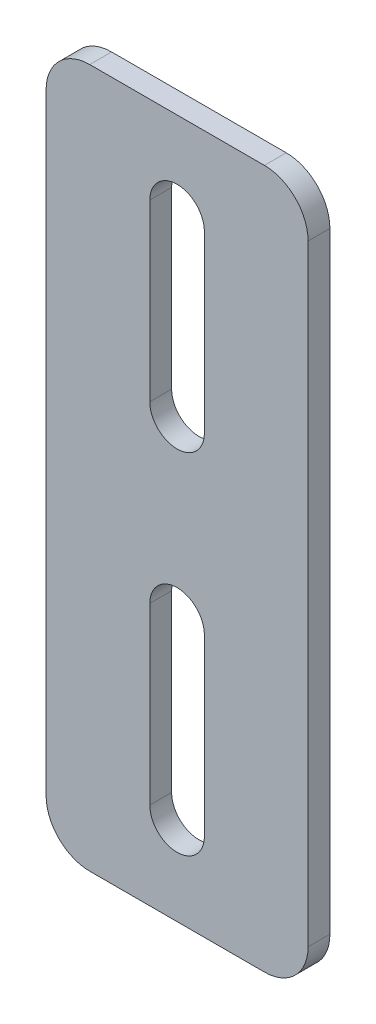
ISO-10303-21;
HEADER;
FILE_DESCRIPTION(('STEP AP214'),'2;1');
FILE_NAME('part.step','',(''),(''),'','','');
FILE_SCHEMA(('AUTOMOTIVE_DESIGN { 1 0 10303 214 1 1 1 1 }'));
ENDSEC;
DATA;
#1=APPLICATION_CONTEXT('core data for automotive mechanical design processes');
#2=APPLICATION_PROTOCOL_DEFINITION('international standard','automotive_design',2000,#1);
#3=PRODUCT_CONTEXT('',#1,'mechanical');
#4=PRODUCT('Part','Part','',(#3));
#5=PRODUCT_RELATED_PRODUCT_CATEGORY('part','',(#4));
#6=PRODUCT_DEFINITION_FORMATION('','',#4);
#7=PRODUCT_DEFINITION_CONTEXT('part definition',#1,'design');
#8=PRODUCT_DEFINITION('design','',#6,#7);
#9=PRODUCT_DEFINITION_SHAPE('','',#8);
#10=(LENGTH_UNIT() NAMED_UNIT(*) SI_UNIT(.MILLI.,.METRE.));
#11=(NAMED_UNIT(*) PLANE_ANGLE_UNIT() SI_UNIT($,.RADIAN.));
#12=(NAMED_UNIT(*) SI_UNIT($,.STERADIAN.) SOLID_ANGLE_UNIT());
#13=UNCERTAINTY_MEASURE_WITH_UNIT(LENGTH_MEASURE(1.E-05),#10,'distance_accuracy_value','');
#14=(GEOMETRIC_REPRESENTATION_CONTEXT(3) GLOBAL_UNCERTAINTY_ASSIGNED_CONTEXT((#13)) GLOBAL_UNIT_ASSIGNED_CONTEXT((#10,
#11,#12)) REPRESENTATION_CONTEXT('',''));
#15=CARTESIAN_POINT('',(0.,0.,0.));
#16=DIRECTION('',(0.,0.,1.));
#17=DIRECTION('',(1.,0.,0.));
#18=AXIS2_PLACEMENT_3D('',#15,#16,#17);
#19=CARTESIAN_POINT('',(19.05,-50.8,3.175));
#20=DIRECTION('',(-1.,0.,0.));
#21=DIRECTION('',(0.,0.,1.));
#22=AXIS2_PLACEMENT_3D('',#19,#20,#21);
#23=PLANE('',#22);
#24=DIRECTION('',(0.,1.,0.));
#25=VECTOR('',#24,1.);
#26=CARTESIAN_POINT('',(19.05,-50.8,3.175));
#27=LINE('',#26,#25);
#28=CARTESIAN_POINT('',(19.05,-44.45,3.175));
#29=VERTEX_POINT('',#28);
#30=CARTESIAN_POINT('',(19.05,44.45,3.175));
#31=VERTEX_POINT('',#30);
#32=EDGE_CURVE('E215',#29,#31,#27,.T.);
#33=ORIENTED_EDGE('',*,*,#32,.F.);
#34=DIRECTION('',(0.,0.,-1.));
#35=VECTOR('',#34,1.);
#36=CARTESIAN_POINT('',(19.05,-44.45,3.175));
#37=LINE('',#36,#35);
#38=CARTESIAN_POINT('',(19.05,-44.45,0.));
#39=VERTEX_POINT('',#38);
#40=EDGE_CURVE('E266',#29,#39,#37,.T.);
#41=ORIENTED_EDGE('',*,*,#40,.T.);
#42=DIRECTION('',(0.,1.,0.));
#43=VECTOR('',#42,1.);
#44=CARTESIAN_POINT('',(19.05,-50.8,0.));
#45=LINE('',#44,#43);
#46=CARTESIAN_POINT('',(19.05,44.45,0.));
#47=VERTEX_POINT('',#46);
#48=EDGE_CURVE('E208',#39,#47,#45,.T.);
#49=ORIENTED_EDGE('',*,*,#48,.T.);
#50=DIRECTION('',(0.,0.,-1.));
#51=VECTOR('',#50,1.);
#52=CARTESIAN_POINT('',(19.05,44.45,3.175));
#53=LINE('',#52,#51);
#54=EDGE_CURVE('E264',#47,#31,#53,.F.);
#55=ORIENTED_EDGE('',*,*,#54,.T.);
#56=EDGE_LOOP('',(#33,#41,#49,#55));
#57=FACE_BOUND('',#56,.T.);
#58=ADVANCED_FACE('F34',(#57),#23,.F.);
#59=CARTESIAN_POINT('',(-19.05,50.8,3.175));
#60=DIRECTION('',(0.,-1.,0.));
#61=DIRECTION('',(0.,0.,-1.));
#62=AXIS2_PLACEMENT_3D('',#59,#60,#61);
#63=PLANE('',#62);
#64=DIRECTION('',(-1.,0.,0.));
#65=VECTOR('',#64,1.);
#66=CARTESIAN_POINT('',(-19.05,50.8,0.));
#67=LINE('',#66,#65);
#68=CARTESIAN_POINT('',(12.7,50.8,0.));
#69=VERTEX_POINT('',#68);
#70=CARTESIAN_POINT('',(-12.7,50.8,0.));
#71=VERTEX_POINT('',#70);
#72=EDGE_CURVE('E231',#69,#71,#67,.T.);
#73=ORIENTED_EDGE('',*,*,#72,.T.);
#74=DIRECTION('',(0.,0.,-1.));
#75=VECTOR('',#74,1.);
#76=CARTESIAN_POINT('',(-12.7,50.8,3.175));
#77=LINE('',#76,#75);
#78=CARTESIAN_POINT('',(-12.7,50.8,3.175));
#79=VERTEX_POINT('',#78);
#80=EDGE_CURVE('E11',#71,#79,#77,.F.);
#81=ORIENTED_EDGE('',*,*,#80,.T.);
#82=DIRECTION('',(-1.,0.,0.));
#83=VECTOR('',#82,1.);
#84=CARTESIAN_POINT('',(-19.05,50.8,3.175));
#85=LINE('',#84,#83);
#86=CARTESIAN_POINT('',(12.7,50.8,3.175));
#87=VERTEX_POINT('',#86);
#88=EDGE_CURVE('E218',#87,#79,#85,.T.);
#89=ORIENTED_EDGE('',*,*,#88,.F.);
#90=DIRECTION('',(0.,0.,-1.));
#91=VECTOR('',#90,1.);
#92=CARTESIAN_POINT('',(12.7,50.8,3.175));
#93=LINE('',#92,#91);
#94=EDGE_CURVE('E42',#87,#69,#93,.T.);
#95=ORIENTED_EDGE('',*,*,#94,.T.);
#96=EDGE_LOOP('',(#73,#81,#89,#95));
#97=FACE_BOUND('',#96,.T.);
#98=ADVANCED_FACE('F273',(#97),#63,.F.);
#99=CARTESIAN_POINT('',(-19.05,-50.8,3.175));
#100=DIRECTION('',(1.,0.,0.));
#101=DIRECTION('',(0.,0.,-1.));
#102=AXIS2_PLACEMENT_3D('',#99,#100,#101);
#103=PLANE('',#102);
#104=DIRECTION('',(0.,-1.,0.));
#105=VECTOR('',#104,1.);
#106=CARTESIAN_POINT('',(-19.05,-50.8,0.));
#107=LINE('',#106,#105);
#108=CARTESIAN_POINT('',(-19.05,44.45,0.));
#109=VERTEX_POINT('',#108);
#110=CARTESIAN_POINT('',(-19.05,-44.45,0.));
#111=VERTEX_POINT('',#110);
#112=EDGE_CURVE('E234',#109,#111,#107,.T.);
#113=ORIENTED_EDGE('',*,*,#112,.T.);
#114=DIRECTION('',(0.,0.,-1.));
#115=VECTOR('',#114,1.);
#116=CARTESIAN_POINT('',(-19.05,-44.45,3.175));
#117=LINE('',#116,#115);
#118=CARTESIAN_POINT('',(-19.05,-44.45,3.175));
#119=VERTEX_POINT('',#118);
#120=EDGE_CURVE('E254',#111,#119,#117,.F.);
#121=ORIENTED_EDGE('',*,*,#120,.T.);
#122=DIRECTION('',(0.,-1.,0.));
#123=VECTOR('',#122,1.);
#124=CARTESIAN_POINT('',(-19.05,-50.8,3.175));
#125=LINE('',#124,#123);
#126=CARTESIAN_POINT('',(-19.05,44.45,3.175));
#127=VERTEX_POINT('',#126);
#128=EDGE_CURVE('E222',#127,#119,#125,.T.);
#129=ORIENTED_EDGE('',*,*,#128,.F.);
#130=DIRECTION('',(0.,0.,-1.));
#131=VECTOR('',#130,1.);
#132=CARTESIAN_POINT('',(-19.05,44.45,3.175));
#133=LINE('',#132,#131);
#134=EDGE_CURVE('E251',#127,#109,#133,.T.);
#135=ORIENTED_EDGE('',*,*,#134,.T.);
#136=EDGE_LOOP('',(#113,#121,#129,#135));
#137=FACE_BOUND('',#136,.T.);
#138=ADVANCED_FACE('F287',(#137),#103,.F.);
#139=CARTESIAN_POINT('',(-19.05,-50.8,3.175));
#140=DIRECTION('',(0.,1.,0.));
#141=DIRECTION('',(0.,0.,1.));
#142=AXIS2_PLACEMENT_3D('',#139,#140,#141);
#143=PLANE('',#142);
#144=DIRECTION('',(1.,0.,0.));
#145=VECTOR('',#144,1.);
#146=CARTESIAN_POINT('',(-19.05,-50.8,3.175));
#147=LINE('',#146,#145);
#148=CARTESIAN_POINT('',(-12.7,-50.8,3.175));
#149=VERTEX_POINT('',#148);
#150=CARTESIAN_POINT('',(12.7,-50.8,3.175));
#151=VERTEX_POINT('',#150);
#152=EDGE_CURVE('E225',#149,#151,#147,.T.);
#153=ORIENTED_EDGE('',*,*,#152,.F.);
#154=DIRECTION('',(0.,0.,-1.));
#155=VECTOR('',#154,1.);
#156=CARTESIAN_POINT('',(-12.7,-50.8,3.175));
#157=LINE('',#156,#155);
#158=CARTESIAN_POINT('',(-12.7,-50.8,0.));
#159=VERTEX_POINT('',#158);
#160=EDGE_CURVE('E240',#149,#159,#157,.T.);
#161=ORIENTED_EDGE('',*,*,#160,.T.);
#162=DIRECTION('',(1.,0.,0.));
#163=VECTOR('',#162,1.);
#164=CARTESIAN_POINT('',(-19.05,-50.8,0.));
#165=LINE('',#164,#163);
#166=CARTESIAN_POINT('',(12.7,-50.8,0.));
#167=VERTEX_POINT('',#166);
#168=EDGE_CURVE('E219',#159,#167,#165,.T.);
#169=ORIENTED_EDGE('',*,*,#168,.T.);
#170=DIRECTION('',(0.,0.,-1.));
#171=VECTOR('',#170,1.);
#172=CARTESIAN_POINT('',(12.7,-50.8,3.175));
#173=LINE('',#172,#171);
#174=EDGE_CURVE('E228',#167,#151,#173,.F.);
#175=ORIENTED_EDGE('',*,*,#174,.T.);
#176=EDGE_LOOP('',(#153,#161,#169,#175));
#177=FACE_BOUND('',#176,.T.);
#178=ADVANCED_FACE('F297',(#177),#143,.F.);
#179=CARTESIAN_POINT('',(19.05,50.8,3.175));
#180=DIRECTION('',(0.,0.,-1.));
#181=DIRECTION('',(-1.,0.,0.));
#182=AXIS2_PLACEMENT_3D('',#179,#180,#181);
#183=PLANE('',#182);
#184=DIRECTION('',(0.,-1.,0.));
#185=VECTOR('',#184,1.);
#186=CARTESIAN_POINT('',(-3.96875,-12.7,3.175));
#187=LINE('',#186,#185);
#188=CARTESIAN_POINT('',(-3.96875,-12.7,3.175));
#189=VERTEX_POINT('',#188);
#190=CARTESIAN_POINT('',(-3.96875,-38.1,3.175));
#191=VERTEX_POINT('',#190);
#192=EDGE_CURVE('E173',#189,#191,#187,.T.);
#193=ORIENTED_EDGE('',*,*,#192,.F.);
#194=CARTESIAN_POINT('',(0.,-12.7,3.175));
#195=DIRECTION('',(0.,0.,1.));
#196=DIRECTION('',(1.,0.,0.));
#197=AXIS2_PLACEMENT_3D('',#194,#195,#196);
#198=CIRCLE('',#197,3.96875);
#199=CARTESIAN_POINT('',(3.96875,-12.7,3.175));
#200=VERTEX_POINT('',#199);
#201=EDGE_CURVE('E49',#200,#189,#198,.T.);
#202=ORIENTED_EDGE('',*,*,#201,.F.);
#203=DIRECTION('',(0.,1.,0.));
#204=VECTOR('',#203,1.);
#205=CARTESIAN_POINT('',(3.96875,-12.7,3.175));
#206=LINE('',#205,#204);
#207=CARTESIAN_POINT('',(3.96875,-38.1,3.175));
#208=VERTEX_POINT('',#207);
#209=EDGE_CURVE('E164',#208,#200,#206,.T.);
#210=ORIENTED_EDGE('',*,*,#209,.F.);
#211=CARTESIAN_POINT('',(0.,-38.1,3.175));
#212=DIRECTION('',(0.,0.,1.));
#213=DIRECTION('',(1.,0.,0.));
#214=AXIS2_PLACEMENT_3D('',#211,#212,#213);
#215=CIRCLE('',#214,3.96875);
#216=EDGE_CURVE('E167',#191,#208,#215,.T.);
#217=ORIENTED_EDGE('',*,*,#216,.F.);
#218=EDGE_LOOP('',(#193,#202,#210,#217));
#219=FACE_BOUND('',#218,.T.);
#220=DIRECTION('',(0.,-1.,0.));
#221=VECTOR('',#220,1.);
#222=CARTESIAN_POINT('',(-3.96875,38.1,3.175));
#223=LINE('',#222,#221);
#224=CARTESIAN_POINT('',(-3.96875,38.1,3.175));
#225=VERTEX_POINT('',#224);
#226=CARTESIAN_POINT('',(-3.96875,12.7,3.175));
#227=VERTEX_POINT('',#226);
#228=EDGE_CURVE('E198',#225,#227,#223,.T.);
#229=ORIENTED_EDGE('',*,*,#228,.F.);
#230=CARTESIAN_POINT('',(0.,38.1,3.175));
#231=DIRECTION('',(0.,0.,1.));
#232=DIRECTION('',(1.,0.,0.));
#233=AXIS2_PLACEMENT_3D('',#230,#231,#232);
#234=CIRCLE('',#233,3.96875);
#235=CARTESIAN_POINT('',(3.96875,38.1,3.175));
#236=VERTEX_POINT('',#235);
#237=EDGE_CURVE('E179',#236,#225,#234,.T.);
#238=ORIENTED_EDGE('',*,*,#237,.F.);
#239=DIRECTION('',(0.,1.,0.));
#240=VECTOR('',#239,1.);
#241=CARTESIAN_POINT('',(3.96875,38.1,3.175));
#242=LINE('',#241,#240);
#243=CARTESIAN_POINT('',(3.96875,12.7,3.175));
#244=VERTEX_POINT('',#243);
#245=EDGE_CURVE('E187',#244,#236,#242,.T.);
#246=ORIENTED_EDGE('',*,*,#245,.F.);
#247=CARTESIAN_POINT('',(0.,12.7,3.175));
#248=DIRECTION('',(0.,0.,1.));
#249=DIRECTION('',(1.,0.,0.));
#250=AXIS2_PLACEMENT_3D('',#247,#248,#249);
#251=CIRCLE('',#250,3.96875);
#252=EDGE_CURVE('E201',#227,#244,#251,.T.);
#253=ORIENTED_EDGE('',*,*,#252,.F.);
#254=EDGE_LOOP('',(#229,#238,#246,#253));
#255=FACE_BOUND('',#254,.T.);
#256=ORIENTED_EDGE('',*,*,#128,.T.);
#257=CARTESIAN_POINT('',(-12.7,-44.45,3.175));
#258=DIRECTION('',(0.,0.,-1.));
#259=DIRECTION('',(-1.,0.,0.));
#260=AXIS2_PLACEMENT_3D('',#257,#258,#259);
#261=CIRCLE('',#260,6.35);
#262=EDGE_CURVE('E262',#119,#149,#261,.F.);
#263=ORIENTED_EDGE('',*,*,#262,.T.);
#264=ORIENTED_EDGE('',*,*,#152,.T.);
#265=CARTESIAN_POINT('',(12.7,-44.45,3.175));
#266=DIRECTION('',(0.,0.,-1.));
#267=DIRECTION('',(-1.,0.,0.));
#268=AXIS2_PLACEMENT_3D('',#265,#266,#267);
#269=CIRCLE('',#268,6.35);
#270=EDGE_CURVE('E260',#151,#29,#269,.F.);
#271=ORIENTED_EDGE('',*,*,#270,.T.);
#272=ORIENTED_EDGE('',*,*,#32,.T.);
#273=CARTESIAN_POINT('',(12.7,44.45,3.175));
#274=DIRECTION('',(0.,0.,-1.));
#275=DIRECTION('',(-1.,0.,0.));
#276=AXIS2_PLACEMENT_3D('',#273,#274,#275);
#277=CIRCLE('',#276,6.35);
#278=EDGE_CURVE('E256',#31,#87,#277,.F.);
#279=ORIENTED_EDGE('',*,*,#278,.T.);
#280=ORIENTED_EDGE('',*,*,#88,.T.);
#281=CARTESIAN_POINT('',(-12.7,44.45,3.175));
#282=DIRECTION('',(0.,0.,-1.));
#283=DIRECTION('',(-1.,0.,0.));
#284=AXIS2_PLACEMENT_3D('',#281,#282,#283);
#285=CIRCLE('',#284,6.35);
#286=EDGE_CURVE('E258',#79,#127,#285,.F.);
#287=ORIENTED_EDGE('',*,*,#286,.T.);
#288=EDGE_LOOP('',(#256,#263,#264,#271,#272,#279,#280,#287));
#289=FACE_BOUND('',#288,.T.);
#290=ADVANCED_FACE('F291',(#219,#255,#289),#183,.F.);
#291=CARTESIAN_POINT('',(19.05,50.8,0.));
#292=DIRECTION('',(0.,0.,-1.));
#293=DIRECTION('',(-1.,0.,0.));
#294=AXIS2_PLACEMENT_3D('',#291,#292,#293);
#295=PLANE('',#294);
#296=CARTESIAN_POINT('',(0.,-12.7,0.));
#297=DIRECTION('',(0.,0.,1.));
#298=DIRECTION('',(1.,0.,0.));
#299=AXIS2_PLACEMENT_3D('',#296,#297,#298);
#300=CIRCLE('',#299,3.96875);
#301=CARTESIAN_POINT('',(3.96875,-12.7,0.));
#302=VERTEX_POINT('',#301);
#303=CARTESIAN_POINT('',(-3.96875,-12.7,0.));
#304=VERTEX_POINT('',#303);
#305=EDGE_CURVE('E148',#302,#304,#300,.T.);
#306=ORIENTED_EDGE('',*,*,#305,.T.);
#307=DIRECTION('',(0.,-1.,0.));
#308=VECTOR('',#307,1.);
#309=CARTESIAN_POINT('',(-3.96875,-12.7,0.));
#310=LINE('',#309,#308);
#311=CARTESIAN_POINT('',(-3.96875,-38.1,0.));
#312=VERTEX_POINT('',#311);
#313=EDGE_CURVE('E157',#304,#312,#310,.T.);
#314=ORIENTED_EDGE('',*,*,#313,.T.);
#315=CARTESIAN_POINT('',(0.,-38.1,0.));
#316=DIRECTION('',(0.,0.,1.));
#317=DIRECTION('',(1.,0.,0.));
#318=AXIS2_PLACEMENT_3D('',#315,#316,#317);
#319=CIRCLE('',#318,3.96875);
#320=CARTESIAN_POINT('',(3.96875,-38.1,0.));
#321=VERTEX_POINT('',#320);
#322=EDGE_CURVE('E57',#312,#321,#319,.T.);
#323=ORIENTED_EDGE('',*,*,#322,.T.);
#324=DIRECTION('',(0.,1.,0.));
#325=VECTOR('',#324,1.);
#326=CARTESIAN_POINT('',(3.96875,-12.7,0.));
#327=LINE('',#326,#325);
#328=EDGE_CURVE('E154',#321,#302,#327,.T.);
#329=ORIENTED_EDGE('',*,*,#328,.T.);
#330=EDGE_LOOP('',(#306,#314,#323,#329));
#331=FACE_BOUND('',#330,.T.);
#332=CARTESIAN_POINT('',(0.,38.1,0.));
#333=DIRECTION('',(0.,0.,1.));
#334=DIRECTION('',(1.,0.,0.));
#335=AXIS2_PLACEMENT_3D('',#332,#333,#334);
#336=CIRCLE('',#335,3.96875);
#337=CARTESIAN_POINT('',(3.96875,38.1,0.));
#338=VERTEX_POINT('',#337);
#339=CARTESIAN_POINT('',(-3.96875,38.1,0.));
#340=VERTEX_POINT('',#339);
#341=EDGE_CURVE('E183',#338,#340,#336,.T.);
#342=ORIENTED_EDGE('',*,*,#341,.T.);
#343=DIRECTION('',(0.,-1.,0.));
#344=VECTOR('',#343,1.);
#345=CARTESIAN_POINT('',(-3.96875,38.1,0.));
#346=LINE('',#345,#344);
#347=CARTESIAN_POINT('',(-3.96875,12.7,0.));
#348=VERTEX_POINT('',#347);
#349=EDGE_CURVE('E186',#340,#348,#346,.T.);
#350=ORIENTED_EDGE('',*,*,#349,.T.);
#351=CARTESIAN_POINT('',(0.,12.7,0.));
#352=DIRECTION('',(0.,0.,1.));
#353=DIRECTION('',(1.,0.,0.));
#354=AXIS2_PLACEMENT_3D('',#351,#352,#353);
#355=CIRCLE('',#354,3.96875);
#356=CARTESIAN_POINT('',(3.96875,12.7,0.));
#357=VERTEX_POINT('',#356);
#358=EDGE_CURVE('E190',#348,#357,#355,.T.);
#359=ORIENTED_EDGE('',*,*,#358,.T.);
#360=DIRECTION('',(0.,1.,0.));
#361=VECTOR('',#360,1.);
#362=CARTESIAN_POINT('',(3.96875,38.1,0.));
#363=LINE('',#362,#361);
#364=EDGE_CURVE('E193',#357,#338,#363,.T.);
#365=ORIENTED_EDGE('',*,*,#364,.T.);
#366=EDGE_LOOP('',(#342,#350,#359,#365));
#367=FACE_BOUND('',#366,.T.);
#368=ORIENTED_EDGE('',*,*,#168,.F.);
#369=CARTESIAN_POINT('',(-12.7,-44.45,0.));
#370=DIRECTION('',(0.,0.,-1.));
#371=DIRECTION('',(-1.,0.,0.));
#372=AXIS2_PLACEMENT_3D('',#369,#370,#371);
#373=CIRCLE('',#372,6.35);
#374=EDGE_CURVE('E249',#159,#111,#373,.T.);
#375=ORIENTED_EDGE('',*,*,#374,.T.);
#376=ORIENTED_EDGE('',*,*,#112,.F.);
#377=CARTESIAN_POINT('',(-12.7,44.45,0.));
#378=DIRECTION('',(0.,0.,-1.));
#379=DIRECTION('',(-1.,0.,0.));
#380=AXIS2_PLACEMENT_3D('',#377,#378,#379);
#381=CIRCLE('',#380,6.35);
#382=EDGE_CURVE('E245',#109,#71,#381,.T.);
#383=ORIENTED_EDGE('',*,*,#382,.T.);
#384=ORIENTED_EDGE('',*,*,#72,.F.);
#385=CARTESIAN_POINT('',(12.7,44.45,0.));
#386=DIRECTION('',(0.,0.,-1.));
#387=DIRECTION('',(-1.,0.,0.));
#388=AXIS2_PLACEMENT_3D('',#385,#386,#387);
#389=CIRCLE('',#388,6.35);
#390=EDGE_CURVE('E243',#69,#47,#389,.T.);
#391=ORIENTED_EDGE('',*,*,#390,.T.);
#392=ORIENTED_EDGE('',*,*,#48,.F.);
#393=CARTESIAN_POINT('',(12.7,-44.45,0.));
#394=DIRECTION('',(0.,0.,-1.));
#395=DIRECTION('',(-1.,0.,0.));
#396=AXIS2_PLACEMENT_3D('',#393,#394,#395);
#397=CIRCLE('',#396,6.35);
#398=EDGE_CURVE('E247',#39,#167,#397,.T.);
#399=ORIENTED_EDGE('',*,*,#398,.T.);
#400=EDGE_LOOP('',(#368,#375,#376,#383,#384,#391,#392,#399));
#401=FACE_BOUND('',#400,.T.);
#402=ADVANCED_FACE('F161',(#331,#367,#401),#295,.T.);
#403=CARTESIAN_POINT('',(-12.7,-44.45,3.175));
#404=DIRECTION('',(0.,0.,-1.));
#405=DIRECTION('',(-1.,0.,0.));
#406=AXIS2_PLACEMENT_3D('',#403,#404,#405);
#407=CYLINDRICAL_SURFACE('',#406,6.35);
#408=ORIENTED_EDGE('',*,*,#262,.F.);
#409=ORIENTED_EDGE('',*,*,#120,.F.);
#410=ORIENTED_EDGE('',*,*,#374,.F.);
#411=ORIENTED_EDGE('',*,*,#160,.F.);
#412=EDGE_LOOP('',(#408,#409,#410,#411));
#413=FACE_BOUND('',#412,.T.);
#414=ADVANCED_FACE('F295',(#413),#407,.T.);
#415=CARTESIAN_POINT('',(12.7,-44.45,3.175));
#416=DIRECTION('',(0.,0.,-1.));
#417=DIRECTION('',(-1.,0.,0.));
#418=AXIS2_PLACEMENT_3D('',#415,#416,#417);
#419=CYLINDRICAL_SURFACE('',#418,6.35);
#420=ORIENTED_EDGE('',*,*,#270,.F.);
#421=ORIENTED_EDGE('',*,*,#174,.F.);
#422=ORIENTED_EDGE('',*,*,#398,.F.);
#423=ORIENTED_EDGE('',*,*,#40,.F.);
#424=EDGE_LOOP('',(#420,#421,#422,#423));
#425=FACE_BOUND('',#424,.T.);
#426=ADVANCED_FACE('F302',(#425),#419,.T.);
#427=CARTESIAN_POINT('',(-12.7,44.45,3.175));
#428=DIRECTION('',(0.,0.,-1.));
#429=DIRECTION('',(-1.,0.,0.));
#430=AXIS2_PLACEMENT_3D('',#427,#428,#429);
#431=CYLINDRICAL_SURFACE('',#430,6.35);
#432=ORIENTED_EDGE('',*,*,#286,.F.);
#433=ORIENTED_EDGE('',*,*,#80,.F.);
#434=ORIENTED_EDGE('',*,*,#382,.F.);
#435=ORIENTED_EDGE('',*,*,#134,.F.);
#436=EDGE_LOOP('',(#432,#433,#434,#435));
#437=FACE_BOUND('',#436,.T.);
#438=ADVANCED_FACE('F284',(#437),#431,.T.);
#439=CARTESIAN_POINT('',(12.7,44.45,3.175));
#440=DIRECTION('',(0.,0.,-1.));
#441=DIRECTION('',(-1.,0.,0.));
#442=AXIS2_PLACEMENT_3D('',#439,#440,#441);
#443=CYLINDRICAL_SURFACE('',#442,6.35);
#444=ORIENTED_EDGE('',*,*,#278,.F.);
#445=ORIENTED_EDGE('',*,*,#54,.F.);
#446=ORIENTED_EDGE('',*,*,#390,.F.);
#447=ORIENTED_EDGE('',*,*,#94,.F.);
#448=EDGE_LOOP('',(#444,#445,#446,#447));
#449=FACE_BOUND('',#448,.T.);
#450=ADVANCED_FACE('F36',(#449),#443,.T.);
#451=CARTESIAN_POINT('',(0.,38.1,0.));
#452=DIRECTION('',(0.,0.,1.));
#453=DIRECTION('',(1.,0.,0.));
#454=AXIS2_PLACEMENT_3D('',#451,#452,#453);
#455=CYLINDRICAL_SURFACE('',#454,3.96875);
#456=ORIENTED_EDGE('',*,*,#237,.T.);
#457=DIRECTION('',(0.,0.,1.));
#458=VECTOR('',#457,1.);
#459=CARTESIAN_POINT('',(-3.96875,38.1,0.));
#460=LINE('',#459,#458);
#461=EDGE_CURVE('E196',#340,#225,#460,.T.);
#462=ORIENTED_EDGE('',*,*,#461,.F.);
#463=ORIENTED_EDGE('',*,*,#341,.F.);
#464=DIRECTION('',(0.,0.,1.));
#465=VECTOR('',#464,1.);
#466=CARTESIAN_POINT('',(3.96875,38.1,0.));
#467=LINE('',#466,#465);
#468=EDGE_CURVE('E206',#338,#236,#467,.T.);
#469=ORIENTED_EDGE('',*,*,#468,.T.);
#470=EDGE_LOOP('',(#456,#462,#463,#469));
#471=FACE_BOUND('',#470,.T.);
#472=ADVANCED_FACE('F307',(#471),#455,.F.);
#473=CARTESIAN_POINT('',(3.96875,38.1,0.));
#474=DIRECTION('',(1.,0.,0.));
#475=DIRECTION('',(0.,0.,-1.));
#476=AXIS2_PLACEMENT_3D('',#473,#474,#475);
#477=PLANE('',#476);
#478=ORIENTED_EDGE('',*,*,#245,.T.);
#479=ORIENTED_EDGE('',*,*,#468,.F.);
#480=ORIENTED_EDGE('',*,*,#364,.F.);
#481=DIRECTION('',(0.,0.,1.));
#482=VECTOR('',#481,1.);
#483=CARTESIAN_POINT('',(3.96875,12.7,0.));
#484=LINE('',#483,#482);
#485=EDGE_CURVE('E209',#357,#244,#484,.T.);
#486=ORIENTED_EDGE('',*,*,#485,.T.);
#487=EDGE_LOOP('',(#478,#479,#480,#486));
#488=FACE_BOUND('',#487,.T.);
#489=ADVANCED_FACE('F312',(#488),#477,.F.);
#490=CARTESIAN_POINT('',(0.,12.7,0.));
#491=DIRECTION('',(0.,0.,1.));
#492=DIRECTION('',(1.,0.,0.));
#493=AXIS2_PLACEMENT_3D('',#490,#491,#492);
#494=CYLINDRICAL_SURFACE('',#493,3.96875);
#495=ORIENTED_EDGE('',*,*,#252,.T.);
#496=ORIENTED_EDGE('',*,*,#485,.F.);
#497=ORIENTED_EDGE('',*,*,#358,.F.);
#498=DIRECTION('',(0.,0.,1.));
#499=VECTOR('',#498,1.);
#500=CARTESIAN_POINT('',(-3.96875,12.7,0.));
#501=LINE('',#500,#499);
#502=EDGE_CURVE('E211',#348,#227,#501,.T.);
#503=ORIENTED_EDGE('',*,*,#502,.T.);
#504=EDGE_LOOP('',(#495,#496,#497,#503));
#505=FACE_BOUND('',#504,.T.);
#506=ADVANCED_FACE('F373',(#505),#494,.F.);
#507=CARTESIAN_POINT('',(-3.96875,38.1,0.));
#508=DIRECTION('',(-1.,0.,0.));
#509=DIRECTION('',(0.,0.,1.));
#510=AXIS2_PLACEMENT_3D('',#507,#508,#509);
#511=PLANE('',#510);
#512=ORIENTED_EDGE('',*,*,#228,.T.);
#513=ORIENTED_EDGE('',*,*,#502,.F.);
#514=ORIENTED_EDGE('',*,*,#349,.F.);
#515=ORIENTED_EDGE('',*,*,#461,.T.);
#516=EDGE_LOOP('',(#512,#513,#514,#515));
#517=FACE_BOUND('',#516,.T.);
#518=ADVANCED_FACE('F383',(#517),#511,.F.);
#519=CARTESIAN_POINT('',(0.,-12.7,0.));
#520=DIRECTION('',(0.,0.,1.));
#521=DIRECTION('',(1.,0.,0.));
#522=AXIS2_PLACEMENT_3D('',#519,#520,#521);
#523=CYLINDRICAL_SURFACE('',#522,3.96875);
#524=ORIENTED_EDGE('',*,*,#201,.T.);
#525=DIRECTION('',(0.,0.,1.));
#526=VECTOR('',#525,1.);
#527=CARTESIAN_POINT('',(-3.96875,-12.7,0.));
#528=LINE('',#527,#526);
#529=EDGE_CURVE('E144',#304,#189,#528,.T.);
#530=ORIENTED_EDGE('',*,*,#529,.F.);
#531=ORIENTED_EDGE('',*,*,#305,.F.);
#532=DIRECTION('',(0.,0.,1.));
#533=VECTOR('',#532,1.);
#534=CARTESIAN_POINT('',(3.96875,-12.7,0.));
#535=LINE('',#534,#533);
#536=EDGE_CURVE('E177',#302,#200,#535,.T.);
#537=ORIENTED_EDGE('',*,*,#536,.T.);
#538=EDGE_LOOP('',(#524,#530,#531,#537));
#539=FACE_BOUND('',#538,.T.);
#540=ADVANCED_FACE('F146',(#539),#523,.F.);
#541=CARTESIAN_POINT('',(3.96875,-12.7,0.));
#542=DIRECTION('',(1.,0.,0.));
#543=DIRECTION('',(0.,0.,-1.));
#544=AXIS2_PLACEMENT_3D('',#541,#542,#543);
#545=PLANE('',#544);
#546=ORIENTED_EDGE('',*,*,#209,.T.);
#547=ORIENTED_EDGE('',*,*,#536,.F.);
#548=ORIENTED_EDGE('',*,*,#328,.F.);
#549=DIRECTION('',(0.,0.,1.));
#550=VECTOR('',#549,1.);
#551=CARTESIAN_POINT('',(3.96875,-38.1,0.));
#552=LINE('',#551,#550);
#553=EDGE_CURVE('E180',#321,#208,#552,.T.);
#554=ORIENTED_EDGE('',*,*,#553,.T.);
#555=EDGE_LOOP('',(#546,#547,#548,#554));
#556=FACE_BOUND('',#555,.T.);
#557=ADVANCED_FACE('F402',(#556),#545,.F.);
#558=CARTESIAN_POINT('',(0.,-38.1,0.));
#559=DIRECTION('',(0.,0.,1.));
#560=DIRECTION('',(1.,0.,0.));
#561=AXIS2_PLACEMENT_3D('',#558,#559,#560);
#562=CYLINDRICAL_SURFACE('',#561,3.96875);
#563=ORIENTED_EDGE('',*,*,#216,.T.);
#564=ORIENTED_EDGE('',*,*,#553,.F.);
#565=ORIENTED_EDGE('',*,*,#322,.F.);
#566=DIRECTION('',(0.,0.,1.));
#567=VECTOR('',#566,1.);
#568=CARTESIAN_POINT('',(-3.96875,-38.1,0.));
#569=LINE('',#568,#567);
#570=EDGE_CURVE('E153',#312,#191,#569,.T.);
#571=ORIENTED_EDGE('',*,*,#570,.T.);
#572=EDGE_LOOP('',(#563,#564,#565,#571));
#573=FACE_BOUND('',#572,.T.);
#574=ADVANCED_FACE('F411',(#573),#562,.F.);
#575=CARTESIAN_POINT('',(-3.96875,-12.7,0.));
#576=DIRECTION('',(-1.,0.,0.));
#577=DIRECTION('',(0.,0.,1.));
#578=AXIS2_PLACEMENT_3D('',#575,#576,#577);
#579=PLANE('',#578);
#580=ORIENTED_EDGE('',*,*,#192,.T.);
#581=ORIENTED_EDGE('',*,*,#570,.F.);
#582=ORIENTED_EDGE('',*,*,#313,.F.);
#583=ORIENTED_EDGE('',*,*,#529,.T.);
#584=EDGE_LOOP('',(#580,#581,#582,#583));
#585=FACE_BOUND('',#584,.T.);
#586=ADVANCED_FACE('F158',(#585),#579,.F.);
#587=CLOSED_SHELL('',(#58,#98,#138,#178,#290,#402,#414,#426,#438,#450,#472,#489,#506,#518,#540,
#557,#574,#586));
#588=MANIFOLD_SOLID_BREP('B2',#587);
#589=ADVANCED_BREP_SHAPE_REPRESENTATION('',(#18,#588),#14);
#590=SHAPE_DEFINITION_REPRESENTATION(#9,#589);
ENDSEC;
END-ISO-10303-21;
